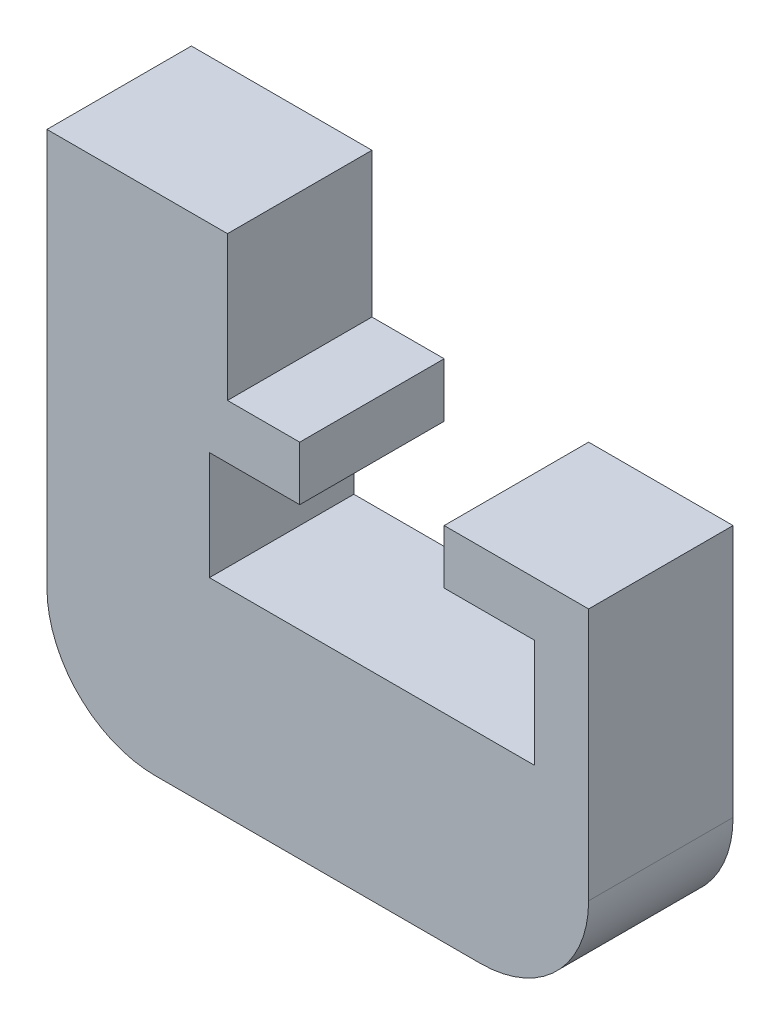
ISO-10303-21;
HEADER;
FILE_DESCRIPTION(('STEP AP214'),'2;1');
FILE_NAME('part.step','',(''),(''),'','','');
FILE_SCHEMA(('AUTOMOTIVE_DESIGN { 1 0 10303 214 1 1 1 1 }'));
ENDSEC;
DATA;
#1=APPLICATION_CONTEXT('core data for automotive mechanical design processes');
#2=APPLICATION_PROTOCOL_DEFINITION('international standard','automotive_design',2000,#1);
#3=PRODUCT_CONTEXT('',#1,'mechanical');
#4=PRODUCT('Part','Part','',(#3));
#5=PRODUCT_RELATED_PRODUCT_CATEGORY('part','',(#4));
#6=PRODUCT_DEFINITION_FORMATION('','',#4);
#7=PRODUCT_DEFINITION_CONTEXT('part definition',#1,'design');
#8=PRODUCT_DEFINITION('design','',#6,#7);
#9=PRODUCT_DEFINITION_SHAPE('','',#8);
#10=(LENGTH_UNIT() NAMED_UNIT(*) SI_UNIT(.MILLI.,.METRE.));
#11=(NAMED_UNIT(*) PLANE_ANGLE_UNIT() SI_UNIT($,.RADIAN.));
#12=(NAMED_UNIT(*) SI_UNIT($,.STERADIAN.) SOLID_ANGLE_UNIT());
#13=UNCERTAINTY_MEASURE_WITH_UNIT(LENGTH_MEASURE(1.E-05),#10,'distance_accuracy_value','');
#14=(GEOMETRIC_REPRESENTATION_CONTEXT(3) GLOBAL_UNCERTAINTY_ASSIGNED_CONTEXT((#13)) GLOBAL_UNIT_ASSIGNED_CONTEXT((#10,
#11,#12)) REPRESENTATION_CONTEXT('',''));
#15=CARTESIAN_POINT('',(0.,0.,0.));
#16=DIRECTION('',(0.,0.,1.));
#17=DIRECTION('',(1.,0.,0.));
#18=AXIS2_PLACEMENT_3D('',#15,#16,#17);
#19=CARTESIAN_POINT('',(-2.,12.0010272230946,4.));
#20=DIRECTION('',(0.,0.,-1.));
#21=DIRECTION('',(-1.,0.,0.));
#22=AXIS2_PLACEMENT_3D('',#19,#20,#21);
#23=CYLINDRICAL_SURFACE('',#22,3.);
#24=CARTESIAN_POINT('',(-2.,12.0010272230946,0.));
#25=DIRECTION('',(0.,0.,1.));
#26=DIRECTION('',(1.,0.,0.));
#27=AXIS2_PLACEMENT_3D('',#24,#25,#26);
#28=CIRCLE('',#27,3.);
#29=CARTESIAN_POINT('',(-5.,12.0010272230947,0.));
#30=VERTEX_POINT('',#29);
#31=CARTESIAN_POINT('',(-1.99999999999998,9.00102722309465,0.));
#32=VERTEX_POINT('',#31);
#33=EDGE_CURVE('E179',#30,#32,#28,.T.);
#34=ORIENTED_EDGE('',*,*,#33,.T.);
#35=DIRECTION('',(0.,0.,-1.));
#36=VECTOR('',#35,1.);
#37=CARTESIAN_POINT('',(-1.99999999999998,9.00102722309465,4.));
#38=LINE('',#37,#36);
#39=CARTESIAN_POINT('',(-1.99999999999998,9.00102722309465,4.));
#40=VERTEX_POINT('',#39);
#41=EDGE_CURVE('E11',#40,#32,#38,.T.);
#42=ORIENTED_EDGE('',*,*,#41,.F.);
#43=CARTESIAN_POINT('',(-2.,12.0010272230946,4.));
#44=DIRECTION('',(0.,0.,1.));
#45=DIRECTION('',(1.,0.,0.));
#46=AXIS2_PLACEMENT_3D('',#43,#44,#45);
#47=CIRCLE('',#46,3.);
#48=CARTESIAN_POINT('',(-5.,12.0010272230947,4.));
#49=VERTEX_POINT('',#48);
#50=EDGE_CURVE('E209',#49,#40,#47,.T.);
#51=ORIENTED_EDGE('',*,*,#50,.F.);
#52=DIRECTION('',(0.,0.,-1.));
#53=VECTOR('',#52,1.);
#54=CARTESIAN_POINT('',(-5.,12.0010272230947,4.));
#55=LINE('',#54,#53);
#56=EDGE_CURVE('E175',#49,#30,#55,.T.);
#57=ORIENTED_EDGE('',*,*,#56,.T.);
#58=EDGE_LOOP('',(#34,#42,#51,#57));
#59=FACE_BOUND('',#58,.T.);
#60=ADVANCED_FACE('F35',(#59),#23,.T.);
#61=CARTESIAN_POINT('',(6.99999999999997,9.00102722309465,4.));
#62=DIRECTION('',(0.,1.,0.));
#63=DIRECTION('',(0.,0.,1.));
#64=AXIS2_PLACEMENT_3D('',#61,#62,#63);
#65=PLANE('',#64);
#66=DIRECTION('',(1.,0.,0.));
#67=VECTOR('',#66,1.);
#68=CARTESIAN_POINT('',(6.99999999999997,9.00102722309465,0.));
#69=LINE('',#68,#67);
#70=CARTESIAN_POINT('',(6.99999999999997,9.00102722309465,0.));
#71=VERTEX_POINT('',#70);
#72=EDGE_CURVE('E182',#32,#71,#69,.T.);
#73=ORIENTED_EDGE('',*,*,#72,.T.);
#74=DIRECTION('',(0.,0.,-1.));
#75=VECTOR('',#74,1.);
#76=CARTESIAN_POINT('',(6.99999999999997,9.00102722309465,4.));
#77=LINE('',#76,#75);
#78=CARTESIAN_POINT('',(6.99999999999997,9.00102722309465,4.));
#79=VERTEX_POINT('',#78);
#80=EDGE_CURVE('E43',#79,#71,#77,.T.);
#81=ORIENTED_EDGE('',*,*,#80,.F.);
#82=DIRECTION('',(1.,0.,0.));
#83=VECTOR('',#82,1.);
#84=CARTESIAN_POINT('',(6.99999999999997,9.00102722309465,4.));
#85=LINE('',#84,#83);
#86=EDGE_CURVE('E118',#40,#79,#85,.T.);
#87=ORIENTED_EDGE('',*,*,#86,.F.);
#88=ORIENTED_EDGE('',*,*,#41,.T.);
#89=EDGE_LOOP('',(#73,#81,#87,#88));
#90=FACE_BOUND('',#89,.T.);
#91=ADVANCED_FACE('F307',(#90),#65,.F.);
#92=CARTESIAN_POINT('',(6.99999999999999,12.0010272230946,4.));
#93=DIRECTION('',(0.,0.,-1.));
#94=DIRECTION('',(-1.,0.,0.));
#95=AXIS2_PLACEMENT_3D('',#92,#93,#94);
#96=CYLINDRICAL_SURFACE('',#95,3.);
#97=CARTESIAN_POINT('',(6.99999999999999,12.0010272230946,0.));
#98=DIRECTION('',(0.,0.,1.));
#99=DIRECTION('',(-1.,0.,0.));
#100=AXIS2_PLACEMENT_3D('',#97,#98,#99);
#101=CIRCLE('',#100,3.);
#102=CARTESIAN_POINT('',(9.99999999999999,12.0010272230947,0.));
#103=VERTEX_POINT('',#102);
#104=EDGE_CURVE('E184',#71,#103,#101,.T.);
#105=ORIENTED_EDGE('',*,*,#104,.T.);
#106=DIRECTION('',(0.,0.,-1.));
#107=VECTOR('',#106,1.);
#108=CARTESIAN_POINT('',(9.99999999999999,12.0010272230947,4.));
#109=LINE('',#108,#107);
#110=CARTESIAN_POINT('',(9.99999999999999,12.0010272230947,4.));
#111=VERTEX_POINT('',#110);
#112=EDGE_CURVE('E240',#111,#103,#109,.T.);
#113=ORIENTED_EDGE('',*,*,#112,.F.);
#114=CARTESIAN_POINT('',(6.99999999999999,12.0010272230946,4.));
#115=DIRECTION('',(0.,0.,1.));
#116=DIRECTION('',(-1.,0.,0.));
#117=AXIS2_PLACEMENT_3D('',#114,#115,#116);
#118=CIRCLE('',#117,3.);
#119=EDGE_CURVE('E248',#79,#111,#118,.T.);
#120=ORIENTED_EDGE('',*,*,#119,.F.);
#121=ORIENTED_EDGE('',*,*,#80,.T.);
#122=EDGE_LOOP('',(#105,#113,#120,#121));
#123=FACE_BOUND('',#122,.T.);
#124=ADVANCED_FACE('F246',(#123),#96,.T.);
#125=CARTESIAN_POINT('',(9.99999999999999,19.0010272230946,4.));
#126=DIRECTION('',(-1.,0.,0.));
#127=DIRECTION('',(0.,0.,1.));
#128=AXIS2_PLACEMENT_3D('',#125,#126,#127);
#129=PLANE('',#128);
#130=DIRECTION('',(0.,1.,0.));
#131=VECTOR('',#130,1.);
#132=CARTESIAN_POINT('',(9.99999999999999,19.0010272230946,0.));
#133=LINE('',#132,#131);
#134=CARTESIAN_POINT('',(9.99999999999999,19.0010272230946,0.));
#135=VERTEX_POINT('',#134);
#136=EDGE_CURVE('E186',#103,#135,#133,.T.);
#137=ORIENTED_EDGE('',*,*,#136,.T.);
#138=DIRECTION('',(0.,0.,-1.));
#139=VECTOR('',#138,1.);
#140=CARTESIAN_POINT('',(9.99999999999999,19.0010272230946,4.));
#141=LINE('',#140,#139);
#142=CARTESIAN_POINT('',(9.99999999999999,19.0010272230946,4.));
#143=VERTEX_POINT('',#142);
#144=EDGE_CURVE('E237',#143,#135,#141,.T.);
#145=ORIENTED_EDGE('',*,*,#144,.F.);
#146=DIRECTION('',(0.,1.,0.));
#147=VECTOR('',#146,1.);
#148=CARTESIAN_POINT('',(9.99999999999999,19.0010272230946,4.));
#149=LINE('',#148,#147);
#150=EDGE_CURVE('E266',#111,#143,#149,.T.);
#151=ORIENTED_EDGE('',*,*,#150,.F.);
#152=ORIENTED_EDGE('',*,*,#112,.T.);
#153=EDGE_LOOP('',(#137,#145,#151,#152));
#154=FACE_BOUND('',#153,.T.);
#155=ADVANCED_FACE('F257',(#154),#129,.F.);
#156=CARTESIAN_POINT('',(6.,19.0010272230946,4.));
#157=DIRECTION('',(0.,-1.,0.));
#158=DIRECTION('',(0.,0.,-1.));
#159=AXIS2_PLACEMENT_3D('',#156,#157,#158);
#160=PLANE('',#159);
#161=DIRECTION('',(-1.,0.,0.));
#162=VECTOR('',#161,1.);
#163=CARTESIAN_POINT('',(6.,19.0010272230946,0.));
#164=LINE('',#163,#162);
#165=CARTESIAN_POINT('',(6.,19.0010272230946,0.));
#166=VERTEX_POINT('',#165);
#167=EDGE_CURVE('E188',#135,#166,#164,.T.);
#168=ORIENTED_EDGE('',*,*,#167,.T.);
#169=DIRECTION('',(0.,0.,-1.));
#170=VECTOR('',#169,1.);
#171=CARTESIAN_POINT('',(6.,19.0010272230946,4.));
#172=LINE('',#171,#170);
#173=CARTESIAN_POINT('',(6.,19.0010272230946,4.));
#174=VERTEX_POINT('',#173);
#175=EDGE_CURVE('E234',#174,#166,#172,.T.);
#176=ORIENTED_EDGE('',*,*,#175,.F.);
#177=DIRECTION('',(-1.,0.,0.));
#178=VECTOR('',#177,1.);
#179=CARTESIAN_POINT('',(6.,19.0010272230946,4.));
#180=LINE('',#179,#178);
#181=EDGE_CURVE('E263',#143,#174,#180,.T.);
#182=ORIENTED_EDGE('',*,*,#181,.F.);
#183=ORIENTED_EDGE('',*,*,#144,.T.);
#184=EDGE_LOOP('',(#168,#176,#182,#183));
#185=FACE_BOUND('',#184,.T.);
#186=ADVANCED_FACE('F261',(#185),#160,.F.);
#187=CARTESIAN_POINT('',(6.,19.0010272230946,4.));
#188=DIRECTION('',(1.,0.,0.));
#189=DIRECTION('',(0.,0.,-1.));
#190=AXIS2_PLACEMENT_3D('',#187,#188,#189);
#191=PLANE('',#190);
#192=DIRECTION('',(0.,-1.,0.));
#193=VECTOR('',#192,1.);
#194=CARTESIAN_POINT('',(6.,19.0010272230946,0.));
#195=LINE('',#194,#193);
#196=CARTESIAN_POINT('',(6.,17.5010272230946,0.));
#197=VERTEX_POINT('',#196);
#198=EDGE_CURVE('E190',#166,#197,#195,.T.);
#199=ORIENTED_EDGE('',*,*,#198,.T.);
#200=DIRECTION('',(0.,0.,-1.));
#201=VECTOR('',#200,1.);
#202=CARTESIAN_POINT('',(6.,17.5010272230946,4.));
#203=LINE('',#202,#201);
#204=CARTESIAN_POINT('',(6.,17.5010272230946,4.));
#205=VERTEX_POINT('',#204);
#206=EDGE_CURVE('E231',#205,#197,#203,.T.);
#207=ORIENTED_EDGE('',*,*,#206,.F.);
#208=DIRECTION('',(0.,-1.,0.));
#209=VECTOR('',#208,1.);
#210=CARTESIAN_POINT('',(6.,19.0010272230946,4.));
#211=LINE('',#210,#209);
#212=EDGE_CURVE('E265',#174,#205,#211,.T.);
#213=ORIENTED_EDGE('',*,*,#212,.F.);
#214=ORIENTED_EDGE('',*,*,#175,.T.);
#215=EDGE_LOOP('',(#199,#207,#213,#214));
#216=FACE_BOUND('',#215,.T.);
#217=ADVANCED_FACE('F320',(#216),#191,.F.);
#218=CARTESIAN_POINT('',(6.,17.5010272230946,4.));
#219=DIRECTION('',(0.,1.,0.));
#220=DIRECTION('',(0.,0.,1.));
#221=AXIS2_PLACEMENT_3D('',#218,#219,#220);
#222=PLANE('',#221);
#223=DIRECTION('',(1.,0.,0.));
#224=VECTOR('',#223,1.);
#225=CARTESIAN_POINT('',(6.,17.5010272230946,0.));
#226=LINE('',#225,#224);
#227=CARTESIAN_POINT('',(8.5,17.5010272230946,0.));
#228=VERTEX_POINT('',#227);
#229=EDGE_CURVE('E192',#197,#228,#226,.T.);
#230=ORIENTED_EDGE('',*,*,#229,.T.);
#231=DIRECTION('',(0.,0.,-1.));
#232=VECTOR('',#231,1.);
#233=CARTESIAN_POINT('',(8.5,17.5010272230946,4.));
#234=LINE('',#233,#232);
#235=CARTESIAN_POINT('',(8.5,17.5010272230946,4.));
#236=VERTEX_POINT('',#235);
#237=EDGE_CURVE('E228',#236,#228,#234,.T.);
#238=ORIENTED_EDGE('',*,*,#237,.F.);
#239=DIRECTION('',(1.,0.,0.));
#240=VECTOR('',#239,1.);
#241=CARTESIAN_POINT('',(6.,17.5010272230946,4.));
#242=LINE('',#241,#240);
#243=EDGE_CURVE('E268',#205,#236,#242,.T.);
#244=ORIENTED_EDGE('',*,*,#243,.F.);
#245=ORIENTED_EDGE('',*,*,#206,.T.);
#246=EDGE_LOOP('',(#230,#238,#244,#245));
#247=FACE_BOUND('',#246,.T.);
#248=ADVANCED_FACE('F323',(#247),#222,.F.);
#249=CARTESIAN_POINT('',(8.5,17.5010272230946,4.));
#250=DIRECTION('',(1.,0.,0.));
#251=DIRECTION('',(0.,0.,-1.));
#252=AXIS2_PLACEMENT_3D('',#249,#250,#251);
#253=PLANE('',#252);
#254=DIRECTION('',(0.,-1.,0.));
#255=VECTOR('',#254,1.);
#256=CARTESIAN_POINT('',(8.5,17.5010272230946,0.));
#257=LINE('',#256,#255);
#258=CARTESIAN_POINT('',(8.5,14.5010272230946,0.));
#259=VERTEX_POINT('',#258);
#260=EDGE_CURVE('E194',#228,#259,#257,.T.);
#261=ORIENTED_EDGE('',*,*,#260,.T.);
#262=DIRECTION('',(0.,0.,-1.));
#263=VECTOR('',#262,1.);
#264=CARTESIAN_POINT('',(8.5,14.5010272230946,4.));
#265=LINE('',#264,#263);
#266=CARTESIAN_POINT('',(8.5,14.5010272230946,4.));
#267=VERTEX_POINT('',#266);
#268=EDGE_CURVE('E225',#267,#259,#265,.T.);
#269=ORIENTED_EDGE('',*,*,#268,.F.);
#270=DIRECTION('',(0.,-1.,0.));
#271=VECTOR('',#270,1.);
#272=CARTESIAN_POINT('',(8.5,17.5010272230946,4.));
#273=LINE('',#272,#271);
#274=EDGE_CURVE('E274',#236,#267,#273,.T.);
#275=ORIENTED_EDGE('',*,*,#274,.F.);
#276=ORIENTED_EDGE('',*,*,#237,.T.);
#277=EDGE_LOOP('',(#261,#269,#275,#276));
#278=FACE_BOUND('',#277,.T.);
#279=ADVANCED_FACE('F327',(#278),#253,.F.);
#280=CARTESIAN_POINT('',(8.5,14.5010272230946,4.));
#281=DIRECTION('',(0.,-1.,0.));
#282=DIRECTION('',(0.,0.,-1.));
#283=AXIS2_PLACEMENT_3D('',#280,#281,#282);
#284=PLANE('',#283);
#285=DIRECTION('',(-1.,0.,0.));
#286=VECTOR('',#285,1.);
#287=CARTESIAN_POINT('',(8.5,14.5010272230946,0.));
#288=LINE('',#287,#286);
#289=CARTESIAN_POINT('',(-0.5,14.5010272230946,0.));
#290=VERTEX_POINT('',#289);
#291=EDGE_CURVE('E196',#259,#290,#288,.T.);
#292=ORIENTED_EDGE('',*,*,#291,.T.);
#293=DIRECTION('',(0.,0.,-1.));
#294=VECTOR('',#293,1.);
#295=CARTESIAN_POINT('',(-0.5,14.5010272230946,4.));
#296=LINE('',#295,#294);
#297=CARTESIAN_POINT('',(-0.5,14.5010272230946,4.));
#298=VERTEX_POINT('',#297);
#299=EDGE_CURVE('E222',#298,#290,#296,.T.);
#300=ORIENTED_EDGE('',*,*,#299,.F.);
#301=DIRECTION('',(-1.,0.,0.));
#302=VECTOR('',#301,1.);
#303=CARTESIAN_POINT('',(8.5,14.5010272230946,4.));
#304=LINE('',#303,#302);
#305=EDGE_CURVE('E276',#267,#298,#304,.T.);
#306=ORIENTED_EDGE('',*,*,#305,.F.);
#307=ORIENTED_EDGE('',*,*,#268,.T.);
#308=EDGE_LOOP('',(#292,#300,#306,#307));
#309=FACE_BOUND('',#308,.T.);
#310=ADVANCED_FACE('F331',(#309),#284,.F.);
#311=CARTESIAN_POINT('',(-0.5,14.5010272230946,4.));
#312=DIRECTION('',(-1.,0.,0.));
#313=DIRECTION('',(0.,0.,1.));
#314=AXIS2_PLACEMENT_3D('',#311,#312,#313);
#315=PLANE('',#314);
#316=DIRECTION('',(0.,1.,0.));
#317=VECTOR('',#316,1.);
#318=CARTESIAN_POINT('',(-0.5,14.5010272230946,0.));
#319=LINE('',#318,#317);
#320=CARTESIAN_POINT('',(-0.5,17.5010272230946,0.));
#321=VERTEX_POINT('',#320);
#322=EDGE_CURVE('E198',#290,#321,#319,.T.);
#323=ORIENTED_EDGE('',*,*,#322,.T.);
#324=DIRECTION('',(0.,0.,-1.));
#325=VECTOR('',#324,1.);
#326=CARTESIAN_POINT('',(-0.5,17.5010272230946,4.));
#327=LINE('',#326,#325);
#328=CARTESIAN_POINT('',(-0.5,17.5010272230946,4.));
#329=VERTEX_POINT('',#328);
#330=EDGE_CURVE('E219',#329,#321,#327,.T.);
#331=ORIENTED_EDGE('',*,*,#330,.F.);
#332=DIRECTION('',(0.,1.,0.));
#333=VECTOR('',#332,1.);
#334=CARTESIAN_POINT('',(-0.5,14.5010272230946,4.));
#335=LINE('',#334,#333);
#336=EDGE_CURVE('E278',#298,#329,#335,.T.);
#337=ORIENTED_EDGE('',*,*,#336,.F.);
#338=ORIENTED_EDGE('',*,*,#299,.T.);
#339=EDGE_LOOP('',(#323,#331,#337,#338));
#340=FACE_BOUND('',#339,.T.);
#341=ADVANCED_FACE('F335',(#340),#315,.F.);
#342=CARTESIAN_POINT('',(-0.5,17.5010272230946,4.));
#343=DIRECTION('',(0.,1.,0.));
#344=DIRECTION('',(0.,0.,1.));
#345=AXIS2_PLACEMENT_3D('',#342,#343,#344);
#346=PLANE('',#345);
#347=DIRECTION('',(1.,0.,0.));
#348=VECTOR('',#347,1.);
#349=CARTESIAN_POINT('',(-0.5,17.5010272230946,0.));
#350=LINE('',#349,#348);
#351=CARTESIAN_POINT('',(2.,17.5010272230946,0.));
#352=VERTEX_POINT('',#351);
#353=EDGE_CURVE('E200',#321,#352,#350,.T.);
#354=ORIENTED_EDGE('',*,*,#353,.T.);
#355=DIRECTION('',(0.,0.,-1.));
#356=VECTOR('',#355,1.);
#357=CARTESIAN_POINT('',(2.,17.5010272230946,4.));
#358=LINE('',#357,#356);
#359=CARTESIAN_POINT('',(2.,17.5010272230946,4.));
#360=VERTEX_POINT('',#359);
#361=EDGE_CURVE('E216',#360,#352,#358,.T.);
#362=ORIENTED_EDGE('',*,*,#361,.F.);
#363=DIRECTION('',(1.,0.,0.));
#364=VECTOR('',#363,1.);
#365=CARTESIAN_POINT('',(-0.5,17.5010272230946,4.));
#366=LINE('',#365,#364);
#367=EDGE_CURVE('E280',#329,#360,#366,.T.);
#368=ORIENTED_EDGE('',*,*,#367,.F.);
#369=ORIENTED_EDGE('',*,*,#330,.T.);
#370=EDGE_LOOP('',(#354,#362,#368,#369));
#371=FACE_BOUND('',#370,.T.);
#372=ADVANCED_FACE('F339',(#371),#346,.F.);
#373=CARTESIAN_POINT('',(2.,17.5010272230946,4.));
#374=DIRECTION('',(-1.,0.,0.));
#375=DIRECTION('',(0.,0.,1.));
#376=AXIS2_PLACEMENT_3D('',#373,#374,#375);
#377=PLANE('',#376);
#378=DIRECTION('',(0.,1.,0.));
#379=VECTOR('',#378,1.);
#380=CARTESIAN_POINT('',(2.,17.5010272230946,0.));
#381=LINE('',#380,#379);
#382=CARTESIAN_POINT('',(2.,19.0010272230946,0.));
#383=VERTEX_POINT('',#382);
#384=EDGE_CURVE('E202',#352,#383,#381,.T.);
#385=ORIENTED_EDGE('',*,*,#384,.T.);
#386=DIRECTION('',(0.,0.,-1.));
#387=VECTOR('',#386,1.);
#388=CARTESIAN_POINT('',(2.,19.0010272230946,4.));
#389=LINE('',#388,#387);
#390=CARTESIAN_POINT('',(2.,19.0010272230946,4.));
#391=VERTEX_POINT('',#390);
#392=EDGE_CURVE('E213',#391,#383,#389,.T.);
#393=ORIENTED_EDGE('',*,*,#392,.F.);
#394=DIRECTION('',(0.,1.,0.));
#395=VECTOR('',#394,1.);
#396=CARTESIAN_POINT('',(2.,17.5010272230946,4.));
#397=LINE('',#396,#395);
#398=EDGE_CURVE('E282',#360,#391,#397,.T.);
#399=ORIENTED_EDGE('',*,*,#398,.F.);
#400=ORIENTED_EDGE('',*,*,#361,.T.);
#401=EDGE_LOOP('',(#385,#393,#399,#400));
#402=FACE_BOUND('',#401,.T.);
#403=ADVANCED_FACE('F288',(#402),#377,.F.);
#404=CARTESIAN_POINT('',(2.,19.0010272230946,4.));
#405=DIRECTION('',(0.,-1.,0.));
#406=DIRECTION('',(0.,0.,-1.));
#407=AXIS2_PLACEMENT_3D('',#404,#405,#406);
#408=PLANE('',#407);
#409=DIRECTION('',(-1.,0.,0.));
#410=VECTOR('',#409,1.);
#411=CARTESIAN_POINT('',(2.,19.0010272230946,0.));
#412=LINE('',#411,#410);
#413=CARTESIAN_POINT('',(0.,19.0010272230946,0.));
#414=VERTEX_POINT('',#413);
#415=EDGE_CURVE('E204',#383,#414,#412,.T.);
#416=ORIENTED_EDGE('',*,*,#415,.T.);
#417=DIRECTION('',(0.,0.,-1.));
#418=VECTOR('',#417,1.);
#419=CARTESIAN_POINT('',(0.,19.0010272230946,4.));
#420=LINE('',#419,#418);
#421=CARTESIAN_POINT('',(0.,19.0010272230946,4.));
#422=VERTEX_POINT('',#421);
#423=EDGE_CURVE('E170',#422,#414,#420,.T.);
#424=ORIENTED_EDGE('',*,*,#423,.F.);
#425=DIRECTION('',(-1.,0.,0.));
#426=VECTOR('',#425,1.);
#427=CARTESIAN_POINT('',(2.,19.0010272230946,4.));
#428=LINE('',#427,#426);
#429=EDGE_CURVE('E161',#391,#422,#428,.T.);
#430=ORIENTED_EDGE('',*,*,#429,.F.);
#431=ORIENTED_EDGE('',*,*,#392,.T.);
#432=EDGE_LOOP('',(#416,#424,#430,#431));
#433=FACE_BOUND('',#432,.T.);
#434=ADVANCED_FACE('F292',(#433),#408,.F.);
#435=CARTESIAN_POINT('',(0.,19.0010272230946,4.));
#436=DIRECTION('',(-1.,0.,0.));
#437=DIRECTION('',(0.,0.,1.));
#438=AXIS2_PLACEMENT_3D('',#435,#436,#437);
#439=PLANE('',#438);
#440=DIRECTION('',(0.,1.,0.));
#441=VECTOR('',#440,1.);
#442=CARTESIAN_POINT('',(0.,19.0010272230946,0.));
#443=LINE('',#442,#441);
#444=CARTESIAN_POINT('',(0.,23.0010272230946,0.));
#445=VERTEX_POINT('',#444);
#446=EDGE_CURVE('E169',#414,#445,#443,.T.);
#447=ORIENTED_EDGE('',*,*,#446,.T.);
#448=DIRECTION('',(0.,0.,-1.));
#449=VECTOR('',#448,1.);
#450=CARTESIAN_POINT('',(0.,23.0010272230946,4.));
#451=LINE('',#450,#449);
#452=CARTESIAN_POINT('',(0.,23.0010272230946,4.));
#453=VERTEX_POINT('',#452);
#454=EDGE_CURVE('E166',#453,#445,#451,.T.);
#455=ORIENTED_EDGE('',*,*,#454,.F.);
#456=DIRECTION('',(0.,1.,0.));
#457=VECTOR('',#456,1.);
#458=CARTESIAN_POINT('',(0.,19.0010272230946,4.));
#459=LINE('',#458,#457);
#460=EDGE_CURVE('E155',#422,#453,#459,.T.);
#461=ORIENTED_EDGE('',*,*,#460,.F.);
#462=ORIENTED_EDGE('',*,*,#423,.T.);
#463=EDGE_LOOP('',(#447,#455,#461,#462));
#464=FACE_BOUND('',#463,.T.);
#465=ADVANCED_FACE('F167',(#464),#439,.F.);
#466=CARTESIAN_POINT('',(0.,23.0010272230946,4.));
#467=DIRECTION('',(0.,-1.,0.));
#468=DIRECTION('',(0.,0.,-1.));
#469=AXIS2_PLACEMENT_3D('',#466,#467,#468);
#470=PLANE('',#469);
#471=DIRECTION('',(-1.,0.,0.));
#472=VECTOR('',#471,1.);
#473=CARTESIAN_POINT('',(0.,23.0010272230946,0.));
#474=LINE('',#473,#472);
#475=CARTESIAN_POINT('',(-5.,23.0010272230946,0.));
#476=VERTEX_POINT('',#475);
#477=EDGE_CURVE('E104',#445,#476,#474,.T.);
#478=ORIENTED_EDGE('',*,*,#477,.T.);
#479=DIRECTION('',(0.,0.,-1.));
#480=VECTOR('',#479,1.);
#481=CARTESIAN_POINT('',(-5.,23.0010272230946,4.));
#482=LINE('',#481,#480);
#483=CARTESIAN_POINT('',(-5.,23.0010272230946,4.));
#484=VERTEX_POINT('',#483);
#485=EDGE_CURVE('E171',#484,#476,#482,.T.);
#486=ORIENTED_EDGE('',*,*,#485,.F.);
#487=DIRECTION('',(-1.,0.,0.));
#488=VECTOR('',#487,1.);
#489=CARTESIAN_POINT('',(0.,23.0010272230946,4.));
#490=LINE('',#489,#488);
#491=EDGE_CURVE('E159',#453,#484,#490,.T.);
#492=ORIENTED_EDGE('',*,*,#491,.F.);
#493=ORIENTED_EDGE('',*,*,#454,.T.);
#494=EDGE_LOOP('',(#478,#486,#492,#493));
#495=FACE_BOUND('',#494,.T.);
#496=ADVANCED_FACE('F173',(#495),#470,.F.);
#497=CARTESIAN_POINT('',(-5.,23.0010272230946,4.));
#498=DIRECTION('',(1.,0.,0.));
#499=DIRECTION('',(0.,1.,0.));
#500=AXIS2_PLACEMENT_3D('',#497,#498,#499);
#501=PLANE('',#500);
#502=DIRECTION('',(0.,-1.,0.));
#503=VECTOR('',#502,1.);
#504=CARTESIAN_POINT('',(-5.,23.0010272230946,0.));
#505=LINE('',#504,#503);
#506=EDGE_CURVE('E110',#476,#30,#505,.T.);
#507=ORIENTED_EDGE('',*,*,#506,.T.);
#508=ORIENTED_EDGE('',*,*,#56,.F.);
#509=DIRECTION('',(0.,-1.,0.));
#510=VECTOR('',#509,1.);
#511=CARTESIAN_POINT('',(-5.,23.0010272230946,4.));
#512=LINE('',#511,#510);
#513=EDGE_CURVE('E51',#484,#49,#512,.T.);
#514=ORIENTED_EDGE('',*,*,#513,.F.);
#515=ORIENTED_EDGE('',*,*,#485,.T.);
#516=EDGE_LOOP('',(#507,#508,#514,#515));
#517=FACE_BOUND('',#516,.T.);
#518=ADVANCED_FACE('F296',(#517),#501,.F.);
#519=CARTESIAN_POINT('',(-2.,12.0010272230946,4.));
#520=DIRECTION('',(0.,0.,1.));
#521=DIRECTION('',(1.,0.,0.));
#522=AXIS2_PLACEMENT_3D('',#519,#520,#521);
#523=PLANE('',#522);
#524=ORIENTED_EDGE('',*,*,#50,.T.);
#525=ORIENTED_EDGE('',*,*,#86,.T.);
#526=ORIENTED_EDGE('',*,*,#119,.T.);
#527=ORIENTED_EDGE('',*,*,#150,.T.);
#528=ORIENTED_EDGE('',*,*,#181,.T.);
#529=ORIENTED_EDGE('',*,*,#212,.T.);
#530=ORIENTED_EDGE('',*,*,#243,.T.);
#531=ORIENTED_EDGE('',*,*,#274,.T.);
#532=ORIENTED_EDGE('',*,*,#305,.T.);
#533=ORIENTED_EDGE('',*,*,#336,.T.);
#534=ORIENTED_EDGE('',*,*,#367,.T.);
#535=ORIENTED_EDGE('',*,*,#398,.T.);
#536=ORIENTED_EDGE('',*,*,#429,.T.);
#537=ORIENTED_EDGE('',*,*,#460,.T.);
#538=ORIENTED_EDGE('',*,*,#491,.T.);
#539=ORIENTED_EDGE('',*,*,#513,.T.);
#540=EDGE_LOOP('',(#524,#525,#526,#527,#528,#529,#530,#531,#532,#533,#534,#535,#536,#537,#538,#539));
#541=FACE_BOUND('',#540,.T.);
#542=ADVANCED_FACE('F157',(#541),#523,.T.);
#543=CARTESIAN_POINT('',(-2.,12.0010272230946,0.));
#544=DIRECTION('',(0.,0.,1.));
#545=DIRECTION('',(1.,0.,0.));
#546=AXIS2_PLACEMENT_3D('',#543,#544,#545);
#547=PLANE('',#546);
#548=ORIENTED_EDGE('',*,*,#33,.F.);
#549=ORIENTED_EDGE('',*,*,#506,.F.);
#550=ORIENTED_EDGE('',*,*,#477,.F.);
#551=ORIENTED_EDGE('',*,*,#446,.F.);
#552=ORIENTED_EDGE('',*,*,#415,.F.);
#553=ORIENTED_EDGE('',*,*,#384,.F.);
#554=ORIENTED_EDGE('',*,*,#353,.F.);
#555=ORIENTED_EDGE('',*,*,#322,.F.);
#556=ORIENTED_EDGE('',*,*,#291,.F.);
#557=ORIENTED_EDGE('',*,*,#260,.F.);
#558=ORIENTED_EDGE('',*,*,#229,.F.);
#559=ORIENTED_EDGE('',*,*,#198,.F.);
#560=ORIENTED_EDGE('',*,*,#167,.F.);
#561=ORIENTED_EDGE('',*,*,#136,.F.);
#562=ORIENTED_EDGE('',*,*,#104,.F.);
#563=ORIENTED_EDGE('',*,*,#72,.F.);
#564=EDGE_LOOP('',(#548,#549,#550,#551,#552,#553,#554,#555,#556,#557,#558,#559,#560,#561,#562,#563));
#565=FACE_BOUND('',#564,.T.);
#566=ADVANCED_FACE('F252',(#565),#547,.F.);
#567=CLOSED_SHELL('',(#60,#91,#124,#155,#186,#217,#248,#279,#310,#341,#372,#403,#434,#465,#496,
#518,#542,#566));
#568=MANIFOLD_SOLID_BREP('B2',#567);
#569=ADVANCED_BREP_SHAPE_REPRESENTATION('',(#18,#568),#14);
#570=SHAPE_DEFINITION_REPRESENTATION(#9,#569);
ENDSEC;
END-ISO-10303-21;
